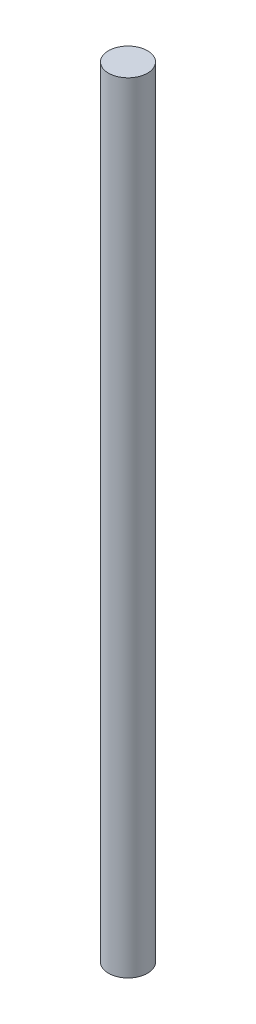
ISO-10303-21;
HEADER;
FILE_DESCRIPTION(('STEP AP214'),'2;1');
FILE_NAME('part.step','',(''),(''),'','','');
FILE_SCHEMA(('AUTOMOTIVE_DESIGN { 1 0 10303 214 1 1 1 1 }'));
ENDSEC;
DATA;
#1=APPLICATION_CONTEXT('core data for automotive mechanical design processes');
#2=APPLICATION_PROTOCOL_DEFINITION('international standard','automotive_design',2000,#1);
#3=PRODUCT_CONTEXT('',#1,'mechanical');
#4=PRODUCT('Part','Part','',(#3));
#5=PRODUCT_RELATED_PRODUCT_CATEGORY('part','',(#4));
#6=PRODUCT_DEFINITION_FORMATION('','',#4);
#7=PRODUCT_DEFINITION_CONTEXT('part definition',#1,'design');
#8=PRODUCT_DEFINITION('design','',#6,#7);
#9=PRODUCT_DEFINITION_SHAPE('','',#8);
#10=(LENGTH_UNIT() NAMED_UNIT(*) SI_UNIT(.MILLI.,.METRE.));
#11=(NAMED_UNIT(*) PLANE_ANGLE_UNIT() SI_UNIT($,.RADIAN.));
#12=(NAMED_UNIT(*) SI_UNIT($,.STERADIAN.) SOLID_ANGLE_UNIT());
#13=UNCERTAINTY_MEASURE_WITH_UNIT(LENGTH_MEASURE(1.E-05),#10,'distance_accuracy_value','');
#14=(GEOMETRIC_REPRESENTATION_CONTEXT(3) GLOBAL_UNCERTAINTY_ASSIGNED_CONTEXT((#13)) GLOBAL_UNIT_ASSIGNED_CONTEXT((#10,
#11,#12)) REPRESENTATION_CONTEXT('',''));
#15=CARTESIAN_POINT('',(0.,0.,0.));
#16=DIRECTION('',(0.,0.,1.));
#17=DIRECTION('',(1.,0.,0.));
#18=AXIS2_PLACEMENT_3D('',#15,#16,#17);
#19=CARTESIAN_POINT('',(0.,100.,0.));
#20=DIRECTION('',(0.,-1.,0.));
#21=DIRECTION('',(0.,0.,-1.));
#22=AXIS2_PLACEMENT_3D('',#19,#20,#21);
#23=CYLINDRICAL_SURFACE('',#22,2.5);
#24=CARTESIAN_POINT('',(0.,100.,0.));
#25=DIRECTION('',(0.,1.,0.));
#26=DIRECTION('',(0.,0.,1.));
#27=AXIS2_PLACEMENT_3D('',#24,#25,#26);
#28=CIRCLE('',#27,2.5);
#29=CARTESIAN_POINT('',(0.,100.,2.5));
#30=VERTEX_POINT('',#29);
#31=EDGE_CURVE('E10',#30,#30,#28,.T.);
#32=ORIENTED_EDGE('',*,*,#31,.F.);
#33=EDGE_LOOP('',(#32));
#34=FACE_BOUND('',#33,.T.);
#35=CARTESIAN_POINT('',(0.,0.,0.));
#36=DIRECTION('',(0.,1.,0.));
#37=DIRECTION('',(0.,0.,1.));
#38=AXIS2_PLACEMENT_3D('',#35,#36,#37);
#39=CIRCLE('',#38,2.5);
#40=CARTESIAN_POINT('',(0.,0.,2.5));
#41=VERTEX_POINT('',#40);
#42=EDGE_CURVE('E44',#41,#41,#39,.T.);
#43=ORIENTED_EDGE('',*,*,#42,.T.);
#44=EDGE_LOOP('',(#43));
#45=FACE_BOUND('',#44,.T.);
#46=ADVANCED_FACE('F41',(#34,#45),#23,.T.);
#47=CARTESIAN_POINT('',(0.,100.,0.));
#48=DIRECTION('',(0.,1.,0.));
#49=DIRECTION('',(0.,0.,1.));
#50=AXIS2_PLACEMENT_3D('',#47,#48,#49);
#51=PLANE('',#50);
#52=ORIENTED_EDGE('',*,*,#31,.T.);
#53=EDGE_LOOP('',(#52));
#54=FACE_BOUND('',#53,.T.);
#55=ADVANCED_FACE('F58',(#54),#51,.T.);
#56=CARTESIAN_POINT('',(0.,0.,0.));
#57=DIRECTION('',(0.,1.,0.));
#58=DIRECTION('',(0.,0.,1.));
#59=AXIS2_PLACEMENT_3D('',#56,#57,#58);
#60=PLANE('',#59);
#61=ORIENTED_EDGE('',*,*,#42,.F.);
#62=EDGE_LOOP('',(#61));
#63=FACE_BOUND('',#62,.T.);
#64=ADVANCED_FACE('F56',(#63),#60,.F.);
#65=CLOSED_SHELL('',(#46,#55,#64));
#66=MANIFOLD_SOLID_BREP('B2',#65);
#67=ADVANCED_BREP_SHAPE_REPRESENTATION('',(#18,#66),#14);
#68=SHAPE_DEFINITION_REPRESENTATION(#9,#67);
ENDSEC;
END-ISO-10303-21;
